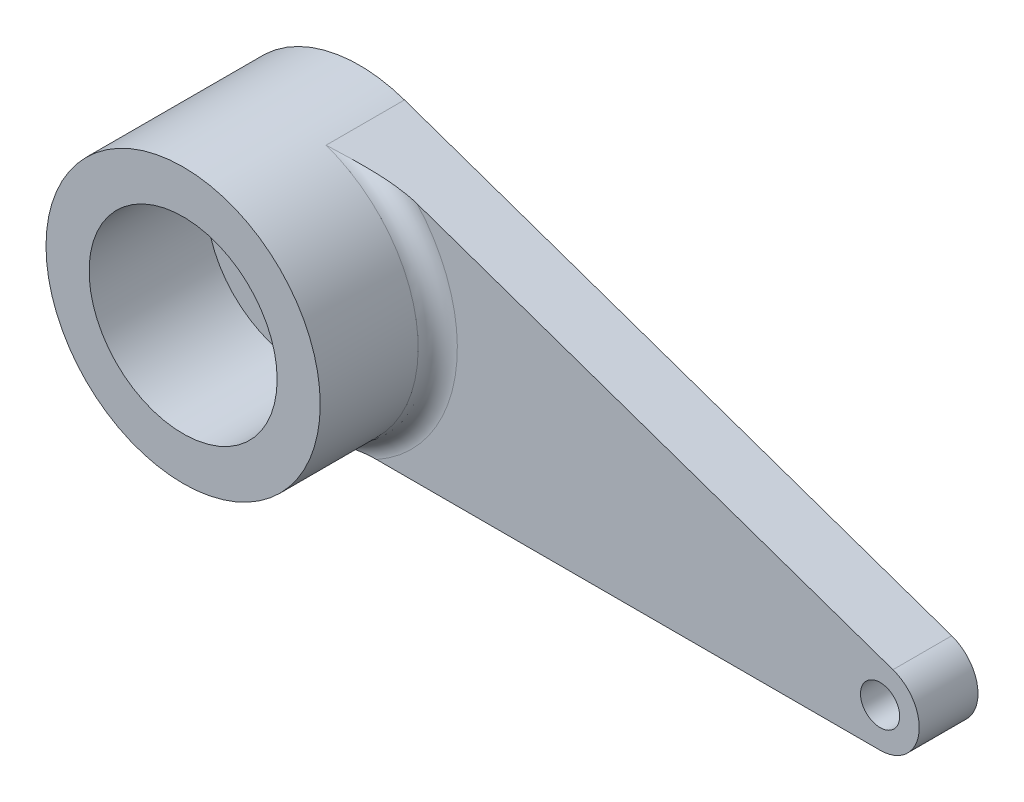
ISO-10303-21;
HEADER;
FILE_DESCRIPTION(('STEP AP214'),'2;1');
FILE_NAME('part.step','',(''),(''),'','','');
FILE_SCHEMA(('AUTOMOTIVE_DESIGN { 1 0 10303 214 1 1 1 1 }'));
ENDSEC;
DATA;
#1=APPLICATION_CONTEXT('core data for automotive mechanical design processes');
#2=APPLICATION_PROTOCOL_DEFINITION('international standard','automotive_design',2000,#1);
#3=PRODUCT_CONTEXT('',#1,'mechanical');
#4=PRODUCT('Part','Part','',(#3));
#5=PRODUCT_RELATED_PRODUCT_CATEGORY('part','',(#4));
#6=PRODUCT_DEFINITION_FORMATION('','',#4);
#7=PRODUCT_DEFINITION_CONTEXT('part definition',#1,'design');
#8=PRODUCT_DEFINITION('design','',#6,#7);
#9=PRODUCT_DEFINITION_SHAPE('','',#8);
#10=(LENGTH_UNIT() NAMED_UNIT(*) SI_UNIT(.MILLI.,.METRE.));
#11=(NAMED_UNIT(*) PLANE_ANGLE_UNIT() SI_UNIT($,.RADIAN.));
#12=(NAMED_UNIT(*) SI_UNIT($,.STERADIAN.) SOLID_ANGLE_UNIT());
#13=UNCERTAINTY_MEASURE_WITH_UNIT(LENGTH_MEASURE(1.E-05),#10,'distance_accuracy_value','');
#14=(GEOMETRIC_REPRESENTATION_CONTEXT(3) GLOBAL_UNCERTAINTY_ASSIGNED_CONTEXT((#13)) GLOBAL_UNIT_ASSIGNED_CONTEXT((#10,
#11,#12)) REPRESENTATION_CONTEXT('',''));
#15=CARTESIAN_POINT('',(0.,0.,0.));
#16=DIRECTION('',(0.,0.,1.));
#17=DIRECTION('',(1.,0.,0.));
#18=AXIS2_PLACEMENT_3D('',#15,#16,#17);
#19=CARTESIAN_POINT('',(0.,0.,1.5));
#20=DIRECTION('',(0.,0.,1.));
#21=DIRECTION('',(1.,0.,0.));
#22=AXIS2_PLACEMENT_3D('',#19,#20,#21);
#23=PLANE('',#22);
#24=CARTESIAN_POINT('',(0.,0.,1.5));
#25=DIRECTION('',(0.,0.,1.));
#26=DIRECTION('',(1.,0.,0.));
#27=AXIS2_PLACEMENT_3D('',#24,#25,#26);
#28=CIRCLE('',#27,1.);
#29=CARTESIAN_POINT('',(1.,0.,1.5));
#30=VERTEX_POINT('',#29);
#31=EDGE_CURVE('E118',#30,#30,#28,.T.);
#32=ORIENTED_EDGE('',*,*,#31,.F.);
#33=EDGE_LOOP('',(#32));
#34=FACE_BOUND('',#33,.T.);
#35=CARTESIAN_POINT('',(0.,0.,1.5));
#36=DIRECTION('',(0.,0.,1.));
#37=DIRECTION('',(1.,0.,0.));
#38=AXIS2_PLACEMENT_3D('',#35,#36,#37);
#39=CIRCLE('',#38,2.4);
#40=CARTESIAN_POINT('',(2.4,0.,1.5));
#41=VERTEX_POINT('',#40);
#42=EDGE_CURVE('E192',#41,#41,#39,.T.);
#43=ORIENTED_EDGE('',*,*,#42,.T.);
#44=EDGE_LOOP('',(#43));
#45=FACE_BOUND('',#44,.T.);
#46=ADVANCED_FACE('F35',(#34,#45),#23,.T.);
#47=DIRECTION('',(-0.944444444444444,0.32867109906109,0.));
#48=VECTOR('',#47,1.);
#49=CARTESIAN_POINT('',(1.15034884671381,3.30555555555556,1.5));
#50=LINE('',#49,#48);
#51=CARTESIAN_POINT('',(15.1188705568101,-1.55555555555555,1.5));
#52=VERTEX_POINT('',#51);
#53=CARTESIAN_POINT('',(2.97925764908954,2.66908670903391,1.5));
#54=VERTEX_POINT('',#53);
#55=EDGE_CURVE('E107',#52,#54,#50,.T.);
#56=ORIENTED_EDGE('',*,*,#55,.T.);
#57=CARTESIAN_POINT('',(0.,0.,1.5));
#58=DIRECTION('',(0.,0.,1.));
#59=DIRECTION('',(1.,0.,0.));
#60=AXIS2_PLACEMENT_3D('',#57,#58,#59);
#61=CIRCLE('',#60,4.);
#62=CARTESIAN_POINT('',(1.93649167310371,-3.5,1.5));
#63=VERTEX_POINT('',#62);
#64=EDGE_CURVE('E61',#54,#63,#61,.F.);
#65=ORIENTED_EDGE('',*,*,#64,.T.);
#66=DIRECTION('',(1.,0.,0.));
#67=VECTOR('',#66,1.);
#68=CARTESIAN_POINT('',(0.,-3.5,1.5));
#69=LINE('',#68,#67);
#70=CARTESIAN_POINT('',(14.790199457749,-3.5,1.5));
#71=VERTEX_POINT('',#70);
#72=EDGE_CURVE('E84',#63,#71,#69,.T.);
#73=ORIENTED_EDGE('',*,*,#72,.T.);
#74=CARTESIAN_POINT('',(14.790199457749,-2.5,1.5));
#75=DIRECTION('',(0.,0.,1.));
#76=DIRECTION('',(1.,0.,0.));
#77=AXIS2_PLACEMENT_3D('',#74,#75,#76);
#78=CIRCLE('',#77,1.);
#79=EDGE_CURVE('E89',#71,#52,#78,.T.);
#80=ORIENTED_EDGE('',*,*,#79,.T.);
#81=EDGE_LOOP('',(#56,#65,#73,#80));
#82=FACE_BOUND('',#81,.T.);
#83=CARTESIAN_POINT('',(14.790199457749,-2.5,1.5));
#84=DIRECTION('',(0.,0.,1.));
#85=DIRECTION('',(1.,0.,0.));
#86=AXIS2_PLACEMENT_3D('',#83,#84,#85);
#87=CIRCLE('',#86,0.500000000000001);
#88=CARTESIAN_POINT('',(15.290199457749,-2.5,1.5));
#89=VERTEX_POINT('',#88);
#90=EDGE_CURVE('E200',#89,#89,#87,.T.);
#91=ORIENTED_EDGE('',*,*,#90,.F.);
#92=EDGE_LOOP('',(#91));
#93=FACE_BOUND('',#92,.T.);
#94=ADVANCED_FACE('F86',(#82,#93),#23,.T.);
#95=CARTESIAN_POINT('',(0.,0.,0.));
#96=DIRECTION('',(0.,0.,1.));
#97=DIRECTION('',(1.,0.,0.));
#98=AXIS2_PLACEMENT_3D('',#95,#96,#97);
#99=PLANE('',#98);
#100=CARTESIAN_POINT('',(0.,0.,0.));
#101=DIRECTION('',(0.,0.,1.));
#102=DIRECTION('',(1.,0.,0.));
#103=AXIS2_PLACEMENT_3D('',#100,#101,#102);
#104=CIRCLE('',#103,1.);
#105=CARTESIAN_POINT('',(1.,0.,0.));
#106=VERTEX_POINT('',#105);
#107=EDGE_CURVE('E113',#106,#106,#104,.T.);
#108=ORIENTED_EDGE('',*,*,#107,.T.);
#109=EDGE_LOOP('',(#108));
#110=FACE_BOUND('',#109,.T.);
#111=CARTESIAN_POINT('',(0.,0.,0.));
#112=DIRECTION('',(0.,0.,1.));
#113=DIRECTION('',(1.,0.,0.));
#114=AXIS2_PLACEMENT_3D('',#111,#112,#113);
#115=CIRCLE('',#114,3.5);
#116=CARTESIAN_POINT('',(1.15034884671381,3.30555555555556,0.));
#117=VERTEX_POINT('',#116);
#118=CARTESIAN_POINT('',(0.,-3.5,0.));
#119=VERTEX_POINT('',#118);
#120=EDGE_CURVE('E115',#117,#119,#115,.T.);
#121=ORIENTED_EDGE('',*,*,#120,.F.);
#122=DIRECTION('',(-0.944444444444444,0.32867109906109,0.));
#123=VECTOR('',#122,1.);
#124=CARTESIAN_POINT('',(1.15034884671381,3.30555555555556,0.));
#125=LINE('',#124,#123);
#126=CARTESIAN_POINT('',(15.1188705568101,-1.55555555555555,0.));
#127=VERTEX_POINT('',#126);
#128=EDGE_CURVE('E93',#127,#117,#125,.T.);
#129=ORIENTED_EDGE('',*,*,#128,.F.);
#130=CARTESIAN_POINT('',(14.790199457749,-2.5,0.));
#131=DIRECTION('',(0.,0.,1.));
#132=DIRECTION('',(1.,0.,0.));
#133=AXIS2_PLACEMENT_3D('',#130,#131,#132);
#134=CIRCLE('',#133,1.);
#135=CARTESIAN_POINT('',(14.790199457749,-3.5,0.));
#136=VERTEX_POINT('',#135);
#137=EDGE_CURVE('E120',#136,#127,#134,.T.);
#138=ORIENTED_EDGE('',*,*,#137,.F.);
#139=DIRECTION('',(1.,0.,0.));
#140=VECTOR('',#139,1.);
#141=CARTESIAN_POINT('',(0.,-3.5,0.));
#142=LINE('',#141,#140);
#143=EDGE_CURVE('E99',#119,#136,#142,.T.);
#144=ORIENTED_EDGE('',*,*,#143,.F.);
#145=EDGE_LOOP('',(#121,#129,#138,#144));
#146=FACE_BOUND('',#145,.T.);
#147=CARTESIAN_POINT('',(14.790199457749,-2.5,0.));
#148=DIRECTION('',(0.,0.,1.));
#149=DIRECTION('',(1.,0.,0.));
#150=AXIS2_PLACEMENT_3D('',#147,#148,#149);
#151=CIRCLE('',#150,0.500000000000001);
#152=CARTESIAN_POINT('',(15.290199457749,-2.5,0.));
#153=VERTEX_POINT('',#152);
#154=EDGE_CURVE('E199',#153,#153,#151,.T.);
#155=ORIENTED_EDGE('',*,*,#154,.T.);
#156=EDGE_LOOP('',(#155));
#157=FACE_BOUND('',#156,.T.);
#158=ADVANCED_FACE('F146',(#110,#146,#157),#99,.F.);
#159=CARTESIAN_POINT('',(0.,0.,1.5));
#160=DIRECTION('',(0.,0.,-1.));
#161=DIRECTION('',(-1.,0.,0.));
#162=AXIS2_PLACEMENT_3D('',#159,#160,#161);
#163=CYLINDRICAL_SURFACE('',#162,3.5);
#164=CARTESIAN_POINT('',(0.,0.,2.));
#165=DIRECTION('',(0.,0.,1.));
#166=DIRECTION('',(1.,0.,0.));
#167=AXIS2_PLACEMENT_3D('',#164,#165,#166);
#168=CIRCLE('',#167,3.5);
#169=CARTESIAN_POINT('',(0.,-3.5,2.));
#170=VERTEX_POINT('',#169);
#171=CARTESIAN_POINT('',(1.15034884671381,3.30555555555556,2.));
#172=VERTEX_POINT('',#171);
#173=EDGE_CURVE('E135',#170,#172,#168,.T.);
#174=ORIENTED_EDGE('',*,*,#173,.T.);
#175=DIRECTION('',(0.,0.,-1.));
#176=VECTOR('',#175,1.);
#177=CARTESIAN_POINT('',(1.15034884671381,3.30555555555556,1.5));
#178=LINE('',#177,#176);
#179=EDGE_CURVE('E109',#172,#117,#178,.T.);
#180=ORIENTED_EDGE('',*,*,#179,.T.);
#181=ORIENTED_EDGE('',*,*,#120,.T.);
#182=DIRECTION('',(0.,0.,-1.));
#183=VECTOR('',#182,1.);
#184=CARTESIAN_POINT('',(0.,-3.5,1.5));
#185=LINE('',#184,#183);
#186=EDGE_CURVE('E102',#170,#119,#185,.T.);
#187=ORIENTED_EDGE('',*,*,#186,.F.);
#188=EDGE_LOOP('',(#174,#180,#181,#187));
#189=FACE_BOUND('',#188,.T.);
#190=CARTESIAN_POINT('',(0.,0.,4.5));
#191=DIRECTION('',(0.,0.,1.));
#192=DIRECTION('',(1.,0.,0.));
#193=AXIS2_PLACEMENT_3D('',#190,#191,#192);
#194=CIRCLE('',#193,3.5);
#195=CARTESIAN_POINT('',(3.5,0.,4.5));
#196=VERTEX_POINT('',#195);
#197=EDGE_CURVE('E194',#196,#196,#194,.T.);
#198=ORIENTED_EDGE('',*,*,#197,.F.);
#199=EDGE_LOOP('',(#198));
#200=FACE_BOUND('',#199,.T.);
#201=ADVANCED_FACE('F151',(#189,#200),#163,.T.);
#202=CARTESIAN_POINT('',(0.,-3.5,1.5));
#203=DIRECTION('',(0.,1.,0.));
#204=DIRECTION('',(-1.,0.,0.));
#205=AXIS2_PLACEMENT_3D('',#202,#203,#204);
#206=PLANE('',#205);
#207=ORIENTED_EDGE('',*,*,#143,.T.);
#208=DIRECTION('',(0.,0.,-1.));
#209=VECTOR('',#208,1.);
#210=CARTESIAN_POINT('',(14.790199457749,-3.5,1.5));
#211=LINE('',#210,#209);
#212=EDGE_CURVE('E96',#71,#136,#211,.T.);
#213=ORIENTED_EDGE('',*,*,#212,.F.);
#214=ORIENTED_EDGE('',*,*,#72,.F.);
#215=CARTESIAN_POINT('',(1.93649167310371,-3.5,1.5));
#216=CARTESIAN_POINT('',(1.89721427116064,-3.5,1.50000688055958));
#217=CARTESIAN_POINT('',(1.85795300241258,-3.5,1.50108376868126));
#218=CARTESIAN_POINT('',(1.77954952366224,-3.5,1.50513053624388));
#219=CARTESIAN_POINT('',(1.74040725688677,-3.5,1.50809929334868));
#220=CARTESIAN_POINT('',(1.62343250963486,-3.5,1.5194546928173));
#221=CARTESIAN_POINT('',(1.54583700601686,-3.5,1.53029321272902));
#222=CARTESIAN_POINT('',(1.39221334918987,-3.5,1.55691107065307));
#223=CARTESIAN_POINT('',(1.31617749670597,-3.5,1.57264797094752));
#224=CARTESIAN_POINT('',(1.16496351788892,-3.5,1.60799764413266));
#225=CARTESIAN_POINT('',(1.08978609518793,-3.5,1.62761338461188));
#226=CARTESIAN_POINT('',(0.844738737014153,-3.5,1.69671727147545));
#227=CARTESIAN_POINT('',(0.676630950730584,-3.5,1.75234571249511));
#228=CARTESIAN_POINT('',(0.342695311549573,-3.5,1.87055583862676));
#229=CARTESIAN_POINT('',(0.176872313030207,-3.49999999999998,1.93315033884253));
#230=CARTESIAN_POINT('',(0.00737865255047693,-3.5,1.9972111343589));
#231=CARTESIAN_POINT('',(0.00368932871599933,-3.5,1.9986055679017));
#232=CARTESIAN_POINT('',(0.,-3.5,2.));
#233=B_SPLINE_CURVE_WITH_KNOTS('',3,(#215,#216,#217,#218,#219,#220,#221,#222,#223,#224,#225,
#226,#227,#228,#229,#230,#231,#232),.UNSPECIFIED.,.F.,.F.,(4,2,2,2,2,2,2,2,4),(0.,
0.117793034054307,0.235516253304811,0.47031974832826,0.703143099091509,0.936145270300911,
1.46690771668575,1.9986632447322,2.01049540430367),.UNSPECIFIED.);
#234=EDGE_CURVE('E11',#63,#170,#233,.T.);
#235=ORIENTED_EDGE('',*,*,#234,.T.);
#236=ORIENTED_EDGE('',*,*,#186,.T.);
#237=EDGE_LOOP('',(#207,#213,#214,#235,#236));
#238=FACE_BOUND('',#237,.T.);
#239=ADVANCED_FACE('F97',(#238),#206,.F.);
#240=CARTESIAN_POINT('',(14.790199457749,-2.5,1.5));
#241=DIRECTION('',(0.,0.,-1.));
#242=DIRECTION('',(-1.,0.,0.));
#243=AXIS2_PLACEMENT_3D('',#240,#241,#242);
#244=CYLINDRICAL_SURFACE('',#243,1.);
#245=ORIENTED_EDGE('',*,*,#137,.T.);
#246=DIRECTION('',(0.,0.,-1.));
#247=VECTOR('',#246,1.);
#248=CARTESIAN_POINT('',(15.1188705568101,-1.55555555555555,1.5));
#249=LINE('',#248,#247);
#250=EDGE_CURVE('E103',#52,#127,#249,.T.);
#251=ORIENTED_EDGE('',*,*,#250,.F.);
#252=ORIENTED_EDGE('',*,*,#79,.F.);
#253=ORIENTED_EDGE('',*,*,#212,.T.);
#254=EDGE_LOOP('',(#245,#251,#252,#253));
#255=FACE_BOUND('',#254,.T.);
#256=ADVANCED_FACE('F105',(#255),#244,.T.);
#257=CARTESIAN_POINT('',(1.15034884671381,3.30555555555556,1.5));
#258=DIRECTION('',(-0.32867109906109,-0.944444444444444,0.));
#259=DIRECTION('',(0.944444444444445,-0.32867109906109,0.));
#260=AXIS2_PLACEMENT_3D('',#257,#258,#259);
#261=PLANE('',#260);
#262=ORIENTED_EDGE('',*,*,#128,.T.);
#263=ORIENTED_EDGE('',*,*,#179,.F.);
#264=CARTESIAN_POINT('',(2.97925764908954,2.66908670903391,1.5));
#265=CARTESIAN_POINT('',(2.94216232503224,2.68199605589879,1.50000688055958));
#266=CARTESIAN_POINT('',(2.90508223788135,2.69490010024873,1.50108376868126));
#267=CARTESIAN_POINT('',(2.83103450795058,2.72066905777978,1.50513053624386));
#268=CARTESIAN_POINT('',(2.79406681155158,2.7335339896206,1.50809929334866));
#269=CARTESIAN_POINT('',(2.68359066136935,2.77198020836223,1.51945469281725));
#270=CARTESIAN_POINT('',(2.61030601906354,2.79748360781853,1.53029321272894));
#271=CARTESIAN_POINT('',(2.46521700983803,2.84797526394965,1.55691107065298));
#272=CARTESIAN_POINT('',(2.39340537138092,2.87296605115361,1.57264797094746));
#273=CARTESIAN_POINT('',(2.25059216916462,2.92266571576488,1.6079976441326));
#274=CARTESIAN_POINT('',(2.17959126994691,2.94737436190863,1.62761338461179));
#275=CARTESIAN_POINT('',(1.94815765389386,3.02791434644163,1.69671727147561));
#276=CARTESIAN_POINT('',(1.78938918907073,3.0831665173201,1.75234571249602));
#277=CARTESIAN_POINT('',(1.47400552984358,3.19292151086561,1.87055583862588));
#278=CARTESIAN_POINT('',(1.31739492012997,3.24742273803889,1.93315033883911));
#279=CARTESIAN_POINT('',(1.15731757412254,3.30313040571222,1.99721113435874));
#280=CARTESIAN_POINT('',(1.15383321272334,3.30434297983168,1.99860556790163));
#281=CARTESIAN_POINT('',(1.15034884671381,3.30555555555556,2.));
#282=B_SPLINE_CURVE_WITH_KNOTS('',3,(#264,#265,#266,#267,#268,#269,#270,#271,#272,#273,#274,
#275,#276,#277,#278,#279,#280,#281),.UNSPECIFIED.,.F.,.F.,(4,2,2,2,2,2,2,2,4),(0.,
0.117793034054141,0.23551625330448,0.470319748327668,0.703143099091234,0.936145270300918,
1.46690771668585,1.99866324473221,2.01049540430367),.UNSPECIFIED.);
#283=EDGE_CURVE('E48',#172,#54,#282,.F.);
#284=ORIENTED_EDGE('',*,*,#283,.T.);
#285=ORIENTED_EDGE('',*,*,#55,.F.);
#286=ORIENTED_EDGE('',*,*,#250,.T.);
#287=EDGE_LOOP('',(#262,#263,#284,#285,#286));
#288=FACE_BOUND('',#287,.T.);
#289=ADVANCED_FACE('F140',(#288),#261,.F.);
#290=CARTESIAN_POINT('',(0.,0.,1.5));
#291=DIRECTION('',(0.,0.,-1.));
#292=DIRECTION('',(-1.,0.,0.));
#293=AXIS2_PLACEMENT_3D('',#290,#291,#292);
#294=CYLINDRICAL_SURFACE('',#293,1.);
#295=ORIENTED_EDGE('',*,*,#31,.T.);
#296=EDGE_LOOP('',(#295));
#297=FACE_BOUND('',#296,.T.);
#298=ORIENTED_EDGE('',*,*,#107,.F.);
#299=EDGE_LOOP('',(#298));
#300=FACE_BOUND('',#299,.T.);
#301=ADVANCED_FACE('F145',(#297,#300),#294,.F.);
#302=CARTESIAN_POINT('',(14.790199457749,-2.5,1.5));
#303=DIRECTION('',(0.,0.,-1.));
#304=DIRECTION('',(-1.,0.,0.));
#305=AXIS2_PLACEMENT_3D('',#302,#303,#304);
#306=CYLINDRICAL_SURFACE('',#305,0.500000000000001);
#307=ORIENTED_EDGE('',*,*,#90,.T.);
#308=EDGE_LOOP('',(#307));
#309=FACE_BOUND('',#308,.T.);
#310=ORIENTED_EDGE('',*,*,#154,.F.);
#311=EDGE_LOOP('',(#310));
#312=FACE_BOUND('',#311,.T.);
#313=ADVANCED_FACE('F170',(#309,#312),#306,.F.);
#314=CARTESIAN_POINT('',(0.,0.,4.5));
#315=DIRECTION('',(0.,0.,1.));
#316=DIRECTION('',(1.,0.,0.));
#317=AXIS2_PLACEMENT_3D('',#314,#315,#316);
#318=PLANE('',#317);
#319=ORIENTED_EDGE('',*,*,#197,.T.);
#320=EDGE_LOOP('',(#319));
#321=FACE_BOUND('',#320,.T.);
#322=CARTESIAN_POINT('',(0.,0.,4.5));
#323=DIRECTION('',(0.,0.,1.));
#324=DIRECTION('',(1.,0.,0.));
#325=AXIS2_PLACEMENT_3D('',#322,#323,#324);
#326=CIRCLE('',#325,2.4);
#327=CARTESIAN_POINT('',(2.4,0.,4.5));
#328=VERTEX_POINT('',#327);
#329=EDGE_CURVE('E189',#328,#328,#326,.T.);
#330=ORIENTED_EDGE('',*,*,#329,.F.);
#331=EDGE_LOOP('',(#330));
#332=FACE_BOUND('',#331,.T.);
#333=ADVANCED_FACE('F174',(#321,#332),#318,.T.);
#334=CARTESIAN_POINT('',(0.,0.,4.5));
#335=DIRECTION('',(0.,0.,-1.));
#336=DIRECTION('',(-1.,0.,0.));
#337=AXIS2_PLACEMENT_3D('',#334,#335,#336);
#338=CYLINDRICAL_SURFACE('',#337,2.4);
#339=ORIENTED_EDGE('',*,*,#329,.T.);
#340=EDGE_LOOP('',(#339));
#341=FACE_BOUND('',#340,.T.);
#342=ORIENTED_EDGE('',*,*,#42,.F.);
#343=EDGE_LOOP('',(#342));
#344=FACE_BOUND('',#343,.T.);
#345=ADVANCED_FACE('F178',(#341,#344),#338,.F.);
#346=CARTESIAN_POINT('',(0.,0.,2.));
#347=DIRECTION('',(0.,0.,1.));
#348=DIRECTION('',(1.,0.,0.));
#349=AXIS2_PLACEMENT_3D('',#346,#347,#348);
#350=TOROIDAL_SURFACE('',#349,4.,0.5);
#351=ORIENTED_EDGE('',*,*,#234,.F.);
#352=ORIENTED_EDGE('',*,*,#64,.F.);
#353=ORIENTED_EDGE('',*,*,#283,.F.);
#354=ORIENTED_EDGE('',*,*,#173,.F.);
#355=EDGE_LOOP('',(#351,#352,#353,#354));
#356=FACE_BOUND('',#355,.T.);
#357=ADVANCED_FACE('F37',(#356),#350,.F.);
#358=CLOSED_SHELL('',(#46,#94,#158,#201,#239,#256,#289,#301,#313,#333,#345,#357));
#359=MANIFOLD_SOLID_BREP('B2',#358);
#360=ADVANCED_BREP_SHAPE_REPRESENTATION('',(#18,#359),#14);
#361=SHAPE_DEFINITION_REPRESENTATION(#9,#360);
ENDSEC;
END-ISO-10303-21;
